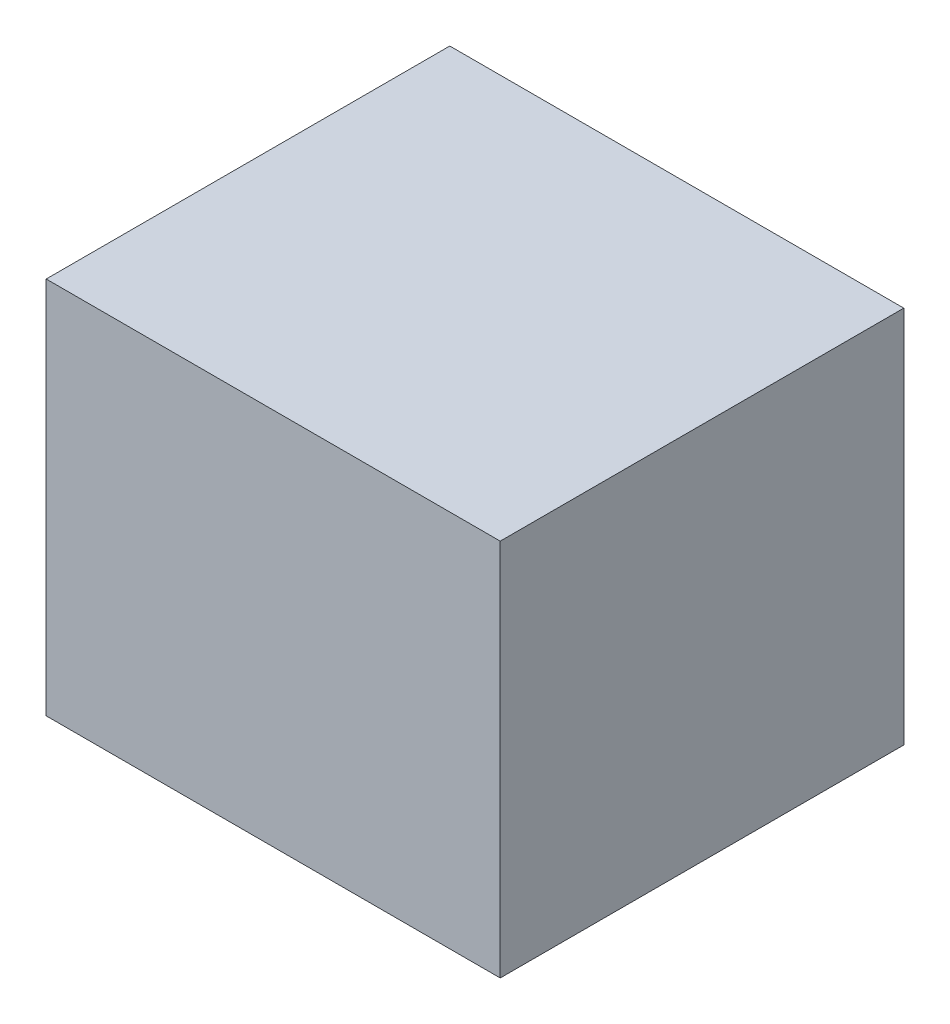
ISO-10303-21;
HEADER;
FILE_DESCRIPTION(('STEP AP214'),'2;1');
FILE_NAME('part.step','',(''),(''),'','','');
FILE_SCHEMA(('AUTOMOTIVE_DESIGN { 1 0 10303 214 1 1 1 1 }'));
ENDSEC;
DATA;
#1=APPLICATION_CONTEXT('core data for automotive mechanical design processes');
#2=APPLICATION_PROTOCOL_DEFINITION('international standard','automotive_design',2000,#1);
#3=PRODUCT_CONTEXT('',#1,'mechanical');
#4=PRODUCT('Part','Part','',(#3));
#5=PRODUCT_RELATED_PRODUCT_CATEGORY('part','',(#4));
#6=PRODUCT_DEFINITION_FORMATION('','',#4);
#7=PRODUCT_DEFINITION_CONTEXT('part definition',#1,'design');
#8=PRODUCT_DEFINITION('design','',#6,#7);
#9=PRODUCT_DEFINITION_SHAPE('','',#8);
#10=(LENGTH_UNIT() NAMED_UNIT(*) SI_UNIT(.MILLI.,.METRE.));
#11=(NAMED_UNIT(*) PLANE_ANGLE_UNIT() SI_UNIT($,.RADIAN.));
#12=(NAMED_UNIT(*) SI_UNIT($,.STERADIAN.) SOLID_ANGLE_UNIT());
#13=UNCERTAINTY_MEASURE_WITH_UNIT(LENGTH_MEASURE(1.E-05),#10,'distance_accuracy_value','');
#14=(GEOMETRIC_REPRESENTATION_CONTEXT(3) GLOBAL_UNCERTAINTY_ASSIGNED_CONTEXT((#13)) GLOBAL_UNIT_ASSIGNED_CONTEXT((#10,
#11,#12)) REPRESENTATION_CONTEXT('',''));
#15=CARTESIAN_POINT('',(0.,0.,0.));
#16=DIRECTION('',(0.,0.,1.));
#17=DIRECTION('',(1.,0.,0.));
#18=AXIS2_PLACEMENT_3D('',#15,#16,#17);
#19=CARTESIAN_POINT('',(9.,15.,8.));
#20=DIRECTION('',(-1.,0.,0.));
#21=DIRECTION('',(0.,0.,1.));
#22=AXIS2_PLACEMENT_3D('',#19,#20,#21);
#23=PLANE('',#22);
#24=DIRECTION('',(0.,0.,-1.));
#25=VECTOR('',#24,1.);
#26=CARTESIAN_POINT('',(9.,0.,8.));
#27=LINE('',#26,#25);
#28=CARTESIAN_POINT('',(9.,0.,8.));
#29=VERTEX_POINT('',#28);
#30=CARTESIAN_POINT('',(9.,0.,-8.));
#31=VERTEX_POINT('',#30);
#32=EDGE_CURVE('E111',#29,#31,#27,.T.);
#33=ORIENTED_EDGE('',*,*,#32,.T.);
#34=DIRECTION('',(0.,-1.,0.));
#35=VECTOR('',#34,1.);
#36=CARTESIAN_POINT('',(9.,15.,-8.));
#37=LINE('',#36,#35);
#38=CARTESIAN_POINT('',(9.,15.,-8.));
#39=VERTEX_POINT('',#38);
#40=EDGE_CURVE('E11',#39,#31,#37,.T.);
#41=ORIENTED_EDGE('',*,*,#40,.F.);
#42=DIRECTION('',(0.,0.,-1.));
#43=VECTOR('',#42,1.);
#44=CARTESIAN_POINT('',(9.,15.,8.));
#45=LINE('',#44,#43);
#46=CARTESIAN_POINT('',(9.,15.,8.));
#47=VERTEX_POINT('',#46);
#48=EDGE_CURVE('E95',#47,#39,#45,.T.);
#49=ORIENTED_EDGE('',*,*,#48,.F.);
#50=DIRECTION('',(0.,-1.,0.));
#51=VECTOR('',#50,1.);
#52=CARTESIAN_POINT('',(9.,15.,8.));
#53=LINE('',#52,#51);
#54=EDGE_CURVE('E107',#47,#29,#53,.T.);
#55=ORIENTED_EDGE('',*,*,#54,.T.);
#56=EDGE_LOOP('',(#33,#41,#49,#55));
#57=FACE_BOUND('',#56,.T.);
#58=ADVANCED_FACE('F43',(#57),#23,.F.);
#59=CARTESIAN_POINT('',(-9.,15.,-8.));
#60=DIRECTION('',(0.,0.,1.));
#61=DIRECTION('',(1.,0.,0.));
#62=AXIS2_PLACEMENT_3D('',#59,#60,#61);
#63=PLANE('',#62);
#64=DIRECTION('',(-1.,0.,0.));
#65=VECTOR('',#64,1.);
#66=CARTESIAN_POINT('',(-9.,0.,-8.));
#67=LINE('',#66,#65);
#68=CARTESIAN_POINT('',(-9.,0.,-8.));
#69=VERTEX_POINT('',#68);
#70=EDGE_CURVE('E100',#31,#69,#67,.T.);
#71=ORIENTED_EDGE('',*,*,#70,.T.);
#72=DIRECTION('',(0.,-1.,0.));
#73=VECTOR('',#72,1.);
#74=CARTESIAN_POINT('',(-9.,15.,-8.));
#75=LINE('',#74,#73);
#76=CARTESIAN_POINT('',(-9.,15.,-8.));
#77=VERTEX_POINT('',#76);
#78=EDGE_CURVE('E52',#77,#69,#75,.T.);
#79=ORIENTED_EDGE('',*,*,#78,.F.);
#80=DIRECTION('',(-1.,0.,0.));
#81=VECTOR('',#80,1.);
#82=CARTESIAN_POINT('',(-9.,15.,-8.));
#83=LINE('',#82,#81);
#84=EDGE_CURVE('E90',#39,#77,#83,.T.);
#85=ORIENTED_EDGE('',*,*,#84,.F.);
#86=ORIENTED_EDGE('',*,*,#40,.T.);
#87=EDGE_LOOP('',(#71,#79,#85,#86));
#88=FACE_BOUND('',#87,.T.);
#89=ADVANCED_FACE('F99',(#88),#63,.F.);
#90=CARTESIAN_POINT('',(-9.,15.,8.));
#91=DIRECTION('',(1.,0.,0.));
#92=DIRECTION('',(0.,0.,-1.));
#93=AXIS2_PLACEMENT_3D('',#90,#91,#92);
#94=PLANE('',#93);
#95=DIRECTION('',(0.,0.,1.));
#96=VECTOR('',#95,1.);
#97=CARTESIAN_POINT('',(-9.,0.,8.));
#98=LINE('',#97,#96);
#99=CARTESIAN_POINT('',(-9.,0.,8.));
#100=VERTEX_POINT('',#99);
#101=EDGE_CURVE('E77',#69,#100,#98,.T.);
#102=ORIENTED_EDGE('',*,*,#101,.T.);
#103=DIRECTION('',(0.,-1.,0.));
#104=VECTOR('',#103,1.);
#105=CARTESIAN_POINT('',(-9.,15.,8.));
#106=LINE('',#105,#104);
#107=CARTESIAN_POINT('',(-9.,15.,8.));
#108=VERTEX_POINT('',#107);
#109=EDGE_CURVE('E102',#108,#100,#106,.T.);
#110=ORIENTED_EDGE('',*,*,#109,.F.);
#111=DIRECTION('',(0.,0.,1.));
#112=VECTOR('',#111,1.);
#113=CARTESIAN_POINT('',(-9.,15.,8.));
#114=LINE('',#113,#112);
#115=EDGE_CURVE('E93',#77,#108,#114,.T.);
#116=ORIENTED_EDGE('',*,*,#115,.F.);
#117=ORIENTED_EDGE('',*,*,#78,.T.);
#118=EDGE_LOOP('',(#102,#110,#116,#117));
#119=FACE_BOUND('',#118,.T.);
#120=ADVANCED_FACE('F103',(#119),#94,.F.);
#121=CARTESIAN_POINT('',(-9.,15.,8.));
#122=DIRECTION('',(0.,0.,-1.));
#123=DIRECTION('',(-1.,0.,0.));
#124=AXIS2_PLACEMENT_3D('',#121,#122,#123);
#125=PLANE('',#124);
#126=DIRECTION('',(1.,0.,0.));
#127=VECTOR('',#126,1.);
#128=CARTESIAN_POINT('',(-9.,0.,8.));
#129=LINE('',#128,#127);
#130=EDGE_CURVE('E83',#100,#29,#129,.T.);
#131=ORIENTED_EDGE('',*,*,#130,.T.);
#132=ORIENTED_EDGE('',*,*,#54,.F.);
#133=DIRECTION('',(1.,0.,0.));
#134=VECTOR('',#133,1.);
#135=CARTESIAN_POINT('',(-9.,15.,8.));
#136=LINE('',#135,#134);
#137=EDGE_CURVE('E60',#108,#47,#136,.T.);
#138=ORIENTED_EDGE('',*,*,#137,.F.);
#139=ORIENTED_EDGE('',*,*,#109,.T.);
#140=EDGE_LOOP('',(#131,#132,#138,#139));
#141=FACE_BOUND('',#140,.T.);
#142=ADVANCED_FACE('F124',(#141),#125,.F.);
#143=CARTESIAN_POINT('',(0.,15.,0.));
#144=DIRECTION('',(0.,-1.,0.));
#145=DIRECTION('',(0.,0.,-1.));
#146=AXIS2_PLACEMENT_3D('',#143,#144,#145);
#147=PLANE('',#146);
#148=ORIENTED_EDGE('',*,*,#48,.T.);
#149=ORIENTED_EDGE('',*,*,#84,.T.);
#150=ORIENTED_EDGE('',*,*,#115,.T.);
#151=ORIENTED_EDGE('',*,*,#137,.T.);
#152=EDGE_LOOP('',(#148,#149,#150,#151));
#153=FACE_BOUND('',#152,.T.);
#154=ADVANCED_FACE('F91',(#153),#147,.F.);
#155=CARTESIAN_POINT('',(0.,0.,0.));
#156=DIRECTION('',(0.,-1.,0.));
#157=DIRECTION('',(0.,0.,-1.));
#158=AXIS2_PLACEMENT_3D('',#155,#156,#157);
#159=PLANE('',#158);
#160=ORIENTED_EDGE('',*,*,#32,.F.);
#161=ORIENTED_EDGE('',*,*,#130,.F.);
#162=ORIENTED_EDGE('',*,*,#101,.F.);
#163=ORIENTED_EDGE('',*,*,#70,.F.);
#164=EDGE_LOOP('',(#160,#161,#162,#163));
#165=FACE_BOUND('',#164,.T.);
#166=ADVANCED_FACE('F127',(#165),#159,.T.);
#167=CLOSED_SHELL('',(#58,#89,#120,#142,#154,#166));
#168=MANIFOLD_SOLID_BREP('B2',#167);
#169=ADVANCED_BREP_SHAPE_REPRESENTATION('',(#18,#168),#14);
#170=SHAPE_DEFINITION_REPRESENTATION(#9,#169);
ENDSEC;
END-ISO-10303-21;
